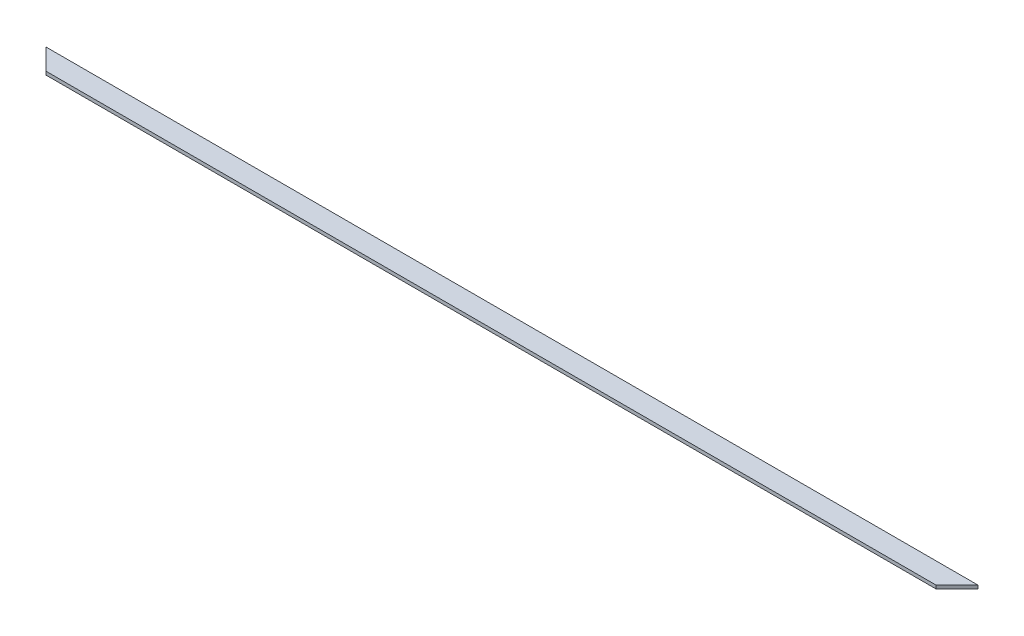
ISO-10303-21;
HEADER;
FILE_DESCRIPTION(('STEP AP214'),'2;1');
FILE_NAME('part.step','',(''),(''),'','','');
FILE_SCHEMA(('AUTOMOTIVE_DESIGN { 1 0 10303 214 1 1 1 1 }'));
ENDSEC;
DATA;
#1=APPLICATION_CONTEXT('core data for automotive mechanical design processes');
#2=APPLICATION_PROTOCOL_DEFINITION('international standard','automotive_design',2000,#1);
#3=PRODUCT_CONTEXT('',#1,'mechanical');
#4=PRODUCT('Part','Part','',(#3));
#5=PRODUCT_RELATED_PRODUCT_CATEGORY('part','',(#4));
#6=PRODUCT_DEFINITION_FORMATION('','',#4);
#7=PRODUCT_DEFINITION_CONTEXT('part definition',#1,'design');
#8=PRODUCT_DEFINITION('design','',#6,#7);
#9=PRODUCT_DEFINITION_SHAPE('','',#8);
#10=(LENGTH_UNIT() NAMED_UNIT(*) SI_UNIT(.MILLI.,.METRE.));
#11=(NAMED_UNIT(*) PLANE_ANGLE_UNIT() SI_UNIT($,.RADIAN.));
#12=(NAMED_UNIT(*) SI_UNIT($,.STERADIAN.) SOLID_ANGLE_UNIT());
#13=UNCERTAINTY_MEASURE_WITH_UNIT(LENGTH_MEASURE(1.E-05),#10,'distance_accuracy_value','');
#14=(GEOMETRIC_REPRESENTATION_CONTEXT(3) GLOBAL_UNCERTAINTY_ASSIGNED_CONTEXT((#13)) GLOBAL_UNIT_ASSIGNED_CONTEXT((#10,
#11,#12)) REPRESENTATION_CONTEXT('',''));
#15=CARTESIAN_POINT('',(0.,0.,0.));
#16=DIRECTION('',(0.,0.,1.));
#17=DIRECTION('',(1.,0.,0.));
#18=AXIS2_PLACEMENT_3D('',#15,#16,#17);
#19=CARTESIAN_POINT('',(-2702.63775510204,21.5900000000002,-921.397959183672));
#20=DIRECTION('',(0.707106781186548,0.,-0.707106781186547));
#21=DIRECTION('',(-0.707106781186547,0.,-0.707106781186548));
#22=AXIS2_PLACEMENT_3D('',#19,#20,#21);
#23=PLANE('',#22);
#24=DIRECTION('',(0.707106781186547,0.,0.707106781186548));
#25=VECTOR('',#24,1.);
#26=CARTESIAN_POINT('',(-2702.63775510204,0.,-921.397959183672));
#27=LINE('',#26,#25);
#28=CARTESIAN_POINT('',(-2702.63775510204,0.,-921.397959183672));
#29=VERTEX_POINT('',#28);
#30=CARTESIAN_POINT('',(-2569.28775510204,0.,-788.047959183674));
#31=VERTEX_POINT('',#30);
#32=EDGE_CURVE('E95',#29,#31,#27,.T.);
#33=ORIENTED_EDGE('',*,*,#32,.T.);
#34=DIRECTION('',(0.,-1.,0.));
#35=VECTOR('',#34,1.);
#36=CARTESIAN_POINT('',(-2569.28775510204,21.5900000000002,-788.047959183674));
#37=LINE('',#36,#35);
#38=CARTESIAN_POINT('',(-2569.28775510204,21.5900000000002,-788.047959183674));
#39=VERTEX_POINT('',#38);
#40=EDGE_CURVE('E11',#39,#31,#37,.T.);
#41=ORIENTED_EDGE('',*,*,#40,.F.);
#42=DIRECTION('',(0.707106781186547,0.,0.707106781186548));
#43=VECTOR('',#42,1.);
#44=CARTESIAN_POINT('',(-2702.63775510204,21.5900000000002,-921.397959183672));
#45=LINE('',#44,#43);
#46=CARTESIAN_POINT('',(-2702.63775510204,21.5900000000002,-921.397959183672));
#47=VERTEX_POINT('',#46);
#48=EDGE_CURVE('E81',#47,#39,#45,.T.);
#49=ORIENTED_EDGE('',*,*,#48,.F.);
#50=DIRECTION('',(0.,-1.,0.));
#51=VECTOR('',#50,1.);
#52=CARTESIAN_POINT('',(-2702.63775510204,21.5900000000002,-921.397959183672));
#53=LINE('',#52,#51);
#54=EDGE_CURVE('E48',#47,#29,#53,.T.);
#55=ORIENTED_EDGE('',*,*,#54,.T.);
#56=EDGE_LOOP('',(#33,#41,#49,#55));
#57=FACE_BOUND('',#56,.T.);
#58=ADVANCED_FACE('F32',(#57),#23,.F.);
#59=CARTESIAN_POINT('',(-2569.28775510204,21.5900000000002,-788.047959183674));
#60=DIRECTION('',(0.,0.,-1.));
#61=DIRECTION('',(-1.,0.,0.));
#62=AXIS2_PLACEMENT_3D('',#59,#60,#61);
#63=PLANE('',#62);
#64=DIRECTION('',(1.,0.,0.));
#65=VECTOR('',#64,1.);
#66=CARTESIAN_POINT('',(-2569.28775510204,0.,-788.047959183674));
#67=LINE('',#66,#65);
#68=CARTESIAN_POINT('',(3094.91224489796,0.,-788.047959183674));
#69=VERTEX_POINT('',#68);
#70=EDGE_CURVE('E86',#31,#69,#67,.T.);
#71=ORIENTED_EDGE('',*,*,#70,.T.);
#72=DIRECTION('',(0.,-1.,0.));
#73=VECTOR('',#72,1.);
#74=CARTESIAN_POINT('',(3094.91224489796,21.5900000000002,-788.047959183674));
#75=LINE('',#74,#73);
#76=CARTESIAN_POINT('',(3094.91224489796,21.5900000000002,-788.047959183674));
#77=VERTEX_POINT('',#76);
#78=EDGE_CURVE('E40',#77,#69,#75,.T.);
#79=ORIENTED_EDGE('',*,*,#78,.F.);
#80=DIRECTION('',(1.,0.,0.));
#81=VECTOR('',#80,1.);
#82=CARTESIAN_POINT('',(-2569.28775510204,21.5900000000002,-788.047959183674));
#83=LINE('',#82,#81);
#84=EDGE_CURVE('E73',#39,#77,#83,.T.);
#85=ORIENTED_EDGE('',*,*,#84,.F.);
#86=ORIENTED_EDGE('',*,*,#40,.T.);
#87=EDGE_LOOP('',(#71,#79,#85,#86));
#88=FACE_BOUND('',#87,.T.);
#89=ADVANCED_FACE('F85',(#88),#63,.F.);
#90=CARTESIAN_POINT('',(3228.26224489796,21.5900000000002,-921.397959183674));
#91=DIRECTION('',(0.707106781186547,0.,0.707106781186548));
#92=DIRECTION('',(0.707106781186548,0.,-0.707106781186547));
#93=AXIS2_PLACEMENT_3D('',#90,#91,#92);
#94=PLANE('',#93);
#95=DIRECTION('',(-0.707106781186548,0.,0.707106781186547));
#96=VECTOR('',#95,1.);
#97=CARTESIAN_POINT('',(3228.26224489796,0.,-921.397959183674));
#98=LINE('',#97,#96);
#99=CARTESIAN_POINT('',(3228.26224489796,0.,-921.397959183674));
#100=VERTEX_POINT('',#99);
#101=EDGE_CURVE('E98',#100,#69,#98,.T.);
#102=ORIENTED_EDGE('',*,*,#101,.F.);
#103=DIRECTION('',(0.,-1.,0.));
#104=VECTOR('',#103,1.);
#105=CARTESIAN_POINT('',(3228.26224489796,21.5900000000002,-921.397959183674));
#106=LINE('',#105,#104);
#107=CARTESIAN_POINT('',(3228.26224489796,21.5900000000002,-921.397959183674));
#108=VERTEX_POINT('',#107);
#109=EDGE_CURVE('E62',#108,#100,#106,.T.);
#110=ORIENTED_EDGE('',*,*,#109,.F.);
#111=DIRECTION('',(-0.707106781186548,0.,0.707106781186547));
#112=VECTOR('',#111,1.);
#113=CARTESIAN_POINT('',(3228.26224489796,21.5900000000002,-921.397959183674));
#114=LINE('',#113,#112);
#115=EDGE_CURVE('E80',#108,#77,#114,.T.);
#116=ORIENTED_EDGE('',*,*,#115,.T.);
#117=ORIENTED_EDGE('',*,*,#78,.T.);
#118=EDGE_LOOP('',(#102,#110,#116,#117));
#119=FACE_BOUND('',#118,.T.);
#120=ADVANCED_FACE('F89',(#119),#94,.T.);
#121=CARTESIAN_POINT('',(-2702.63775510204,21.5900000000002,-921.397959183672));
#122=DIRECTION('',(0.,0.,-1.));
#123=DIRECTION('',(-1.,0.,0.));
#124=AXIS2_PLACEMENT_3D('',#121,#122,#123);
#125=PLANE('',#124);
#126=DIRECTION('',(1.,0.,0.));
#127=VECTOR('',#126,1.);
#128=CARTESIAN_POINT('',(-2702.63775510204,0.,-921.397959183672));
#129=LINE('',#128,#127);
#130=EDGE_CURVE('E100',#29,#100,#129,.T.);
#131=ORIENTED_EDGE('',*,*,#130,.F.);
#132=ORIENTED_EDGE('',*,*,#54,.F.);
#133=DIRECTION('',(1.,0.,0.));
#134=VECTOR('',#133,1.);
#135=CARTESIAN_POINT('',(-2702.63775510204,21.5900000000002,-921.397959183672));
#136=LINE('',#135,#134);
#137=EDGE_CURVE('E90',#47,#108,#136,.T.);
#138=ORIENTED_EDGE('',*,*,#137,.T.);
#139=ORIENTED_EDGE('',*,*,#109,.T.);
#140=EDGE_LOOP('',(#131,#132,#138,#139));
#141=FACE_BOUND('',#140,.T.);
#142=ADVANCED_FACE('F106',(#141),#125,.T.);
#143=CARTESIAN_POINT('',(0.,21.5900000000002,0.));
#144=DIRECTION('',(0.,-1.,0.));
#145=DIRECTION('',(0.,0.,-1.));
#146=AXIS2_PLACEMENT_3D('',#143,#144,#145);
#147=PLANE('',#146);
#148=ORIENTED_EDGE('',*,*,#48,.T.);
#149=ORIENTED_EDGE('',*,*,#84,.T.);
#150=ORIENTED_EDGE('',*,*,#115,.F.);
#151=ORIENTED_EDGE('',*,*,#137,.F.);
#152=EDGE_LOOP('',(#148,#149,#150,#151));
#153=FACE_BOUND('',#152,.T.);
#154=ADVANCED_FACE('F77',(#153),#147,.F.);
#155=CARTESIAN_POINT('',(0.,0.,0.));
#156=DIRECTION('',(0.,-1.,0.));
#157=DIRECTION('',(0.,0.,-1.));
#158=AXIS2_PLACEMENT_3D('',#155,#156,#157);
#159=PLANE('',#158);
#160=ORIENTED_EDGE('',*,*,#32,.F.);
#161=ORIENTED_EDGE('',*,*,#130,.T.);
#162=ORIENTED_EDGE('',*,*,#101,.T.);
#163=ORIENTED_EDGE('',*,*,#70,.F.);
#164=EDGE_LOOP('',(#160,#161,#162,#163));
#165=FACE_BOUND('',#164,.T.);
#166=ADVANCED_FACE('F105',(#165),#159,.T.);
#167=CLOSED_SHELL('',(#58,#89,#120,#142,#154,#166));
#168=MANIFOLD_SOLID_BREP('B2',#167);
#169=ADVANCED_BREP_SHAPE_REPRESENTATION('',(#18,#168),#14);
#170=SHAPE_DEFINITION_REPRESENTATION(#9,#169);
ENDSEC;
END-ISO-10303-21;
